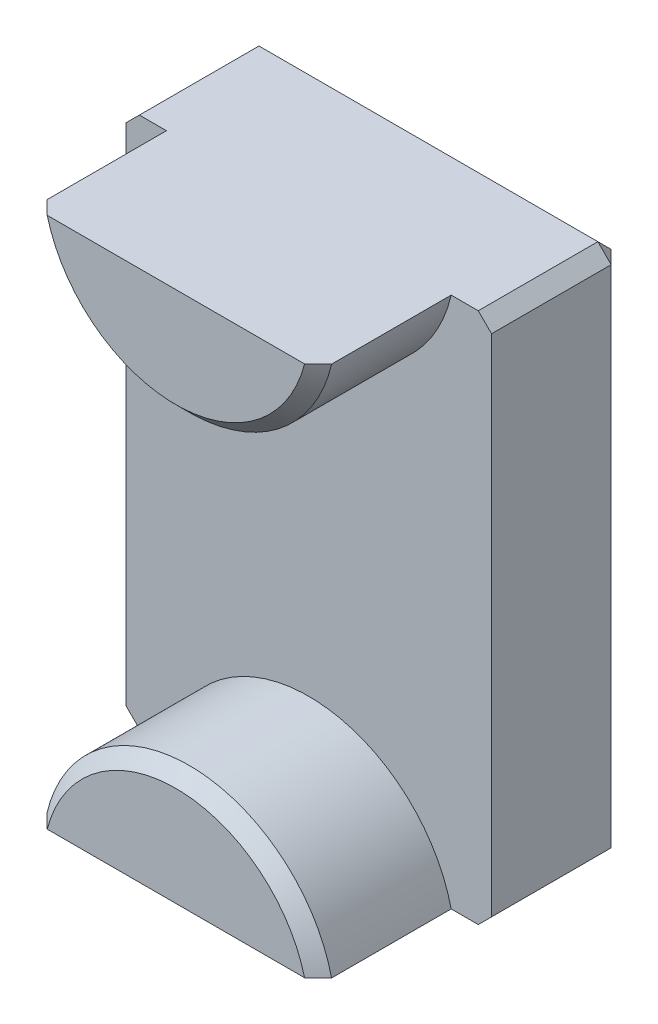
ISO-10303-21;
HEADER;
FILE_DESCRIPTION(('STEP AP214'),'2;1');
FILE_NAME('part.step','',(''),(''),'','','');
FILE_SCHEMA(('AUTOMOTIVE_DESIGN { 1 0 10303 214 1 1 1 1 }'));
ENDSEC;
DATA;
#1=APPLICATION_CONTEXT('core data for automotive mechanical design processes');
#2=APPLICATION_PROTOCOL_DEFINITION('international standard','automotive_design',2000,#1);
#3=PRODUCT_CONTEXT('',#1,'mechanical');
#4=PRODUCT('Part','Part','',(#3));
#5=PRODUCT_RELATED_PRODUCT_CATEGORY('part','',(#4));
#6=PRODUCT_DEFINITION_FORMATION('','',#4);
#7=PRODUCT_DEFINITION_CONTEXT('part definition',#1,'design');
#8=PRODUCT_DEFINITION('design','',#6,#7);
#9=PRODUCT_DEFINITION_SHAPE('','',#8);
#10=(LENGTH_UNIT() NAMED_UNIT(*) SI_UNIT(.MILLI.,.METRE.));
#11=(NAMED_UNIT(*) PLANE_ANGLE_UNIT() SI_UNIT($,.RADIAN.));
#12=(NAMED_UNIT(*) SI_UNIT($,.STERADIAN.) SOLID_ANGLE_UNIT());
#13=UNCERTAINTY_MEASURE_WITH_UNIT(LENGTH_MEASURE(1.E-05),#10,'distance_accuracy_value','');
#14=(GEOMETRIC_REPRESENTATION_CONTEXT(3) GLOBAL_UNCERTAINTY_ASSIGNED_CONTEXT((#13)) GLOBAL_UNIT_ASSIGNED_CONTEXT((#10,
#11,#12)) REPRESENTATION_CONTEXT('',''));
#15=CARTESIAN_POINT('',(0.,0.,0.));
#16=DIRECTION('',(0.,0.,1.));
#17=DIRECTION('',(1.,0.,0.));
#18=AXIS2_PLACEMENT_3D('',#15,#16,#17);
#19=CARTESIAN_POINT('',(2.75,4.,-2.));
#20=DIRECTION('',(1.,0.,0.));
#21=DIRECTION('',(0.,0.,-1.));
#22=AXIS2_PLACEMENT_3D('',#19,#20,#21);
#23=PLANE('',#22);
#24=DIRECTION('',(0.,1.,0.));
#25=VECTOR('',#24,1.);
#26=CARTESIAN_POINT('',(2.75,4.,0.));
#27=LINE('',#26,#25);
#28=CARTESIAN_POINT('',(2.75,-3.8,0.));
#29=VERTEX_POINT('',#28);
#30=CARTESIAN_POINT('',(2.75,3.8,0.));
#31=VERTEX_POINT('',#30);
#32=EDGE_CURVE('E200',#29,#31,#27,.T.);
#33=ORIENTED_EDGE('',*,*,#32,.F.);
#34=DIRECTION('',(0.,0.,-1.));
#35=VECTOR('',#34,1.);
#36=CARTESIAN_POINT('',(2.75,-3.8,-2.));
#37=LINE('',#36,#35);
#38=CARTESIAN_POINT('',(2.75,-3.8,-1.8));
#39=VERTEX_POINT('',#38);
#40=EDGE_CURVE('E11',#29,#39,#37,.T.);
#41=ORIENTED_EDGE('',*,*,#40,.T.);
#42=DIRECTION('',(0.,1.,0.));
#43=VECTOR('',#42,1.);
#44=CARTESIAN_POINT('',(2.75,4.,-1.8));
#45=LINE('',#44,#43);
#46=CARTESIAN_POINT('',(2.75,3.8,-1.8));
#47=VERTEX_POINT('',#46);
#48=EDGE_CURVE('E51',#39,#47,#45,.T.);
#49=ORIENTED_EDGE('',*,*,#48,.T.);
#50=DIRECTION('',(0.,0.,1.));
#51=VECTOR('',#50,1.);
#52=CARTESIAN_POINT('',(2.75,3.8,-2.));
#53=LINE('',#52,#51);
#54=EDGE_CURVE('E288',#47,#31,#53,.T.);
#55=ORIENTED_EDGE('',*,*,#54,.T.);
#56=EDGE_LOOP('',(#33,#41,#49,#55));
#57=FACE_BOUND('',#56,.T.);
#58=ADVANCED_FACE('F41',(#57),#23,.T.);
#59=CARTESIAN_POINT('',(-2.75,-4.,-2.));
#60=DIRECTION('',(0.,-1.,0.));
#61=DIRECTION('',(0.,0.,-1.));
#62=AXIS2_PLACEMENT_3D('',#59,#60,#61);
#63=PLANE('',#62);
#64=DIRECTION('',(0.,0.,-1.));
#65=VECTOR('',#64,1.);
#66=CARTESIAN_POINT('',(2.14242852856286,-4.,2.));
#67=LINE('',#66,#65);
#68=CARTESIAN_POINT('',(2.14242852856286,-4.,1.8));
#69=VERTEX_POINT('',#68);
#70=CARTESIAN_POINT('',(2.14242852856286,-4.,0.));
#71=VERTEX_POINT('',#70);
#72=EDGE_CURVE('E180',#69,#71,#67,.T.);
#73=ORIENTED_EDGE('',*,*,#72,.F.);
#74=CARTESIAN_POINT('',(2.14242852856286,-4.,1.8));
#75=CARTESIAN_POINT('',(2.10815351698605,-4.,1.83338254815782));
#76=CARTESIAN_POINT('',(2.07385460699673,-4.,1.86674048849602));
#77=CARTESIAN_POINT('',(2.00520898851269,-4.,1.93340715516509));
#78=CARTESIAN_POINT('',(1.97086228001563,-4.,1.96671588149356));
#79=CARTESIAN_POINT('',(1.93649167310371,-4.,2.));
#80=B_SPLINE_CURVE_WITH_KNOTS('',3,(#74,#75,#76,#77,#78,#79),.UNSPECIFIED.,.F.,.F.,(4,2,4),(0.,
0.143535733148788,0.287071473324752),.UNSPECIFIED.);
#81=CARTESIAN_POINT('',(1.93649167310371,-4.,2.));
#82=VERTEX_POINT('',#81);
#83=EDGE_CURVE('E223',#69,#82,#80,.T.);
#84=ORIENTED_EDGE('',*,*,#83,.T.);
#85=DIRECTION('',(-1.,0.,0.));
#86=VECTOR('',#85,1.);
#87=CARTESIAN_POINT('',(0.,-4.,2.));
#88=LINE('',#87,#86);
#89=CARTESIAN_POINT('',(-1.93649167310371,-4.,2.));
#90=VERTEX_POINT('',#89);
#91=EDGE_CURVE('E181',#82,#90,#88,.T.);
#92=ORIENTED_EDGE('',*,*,#91,.T.);
#93=CARTESIAN_POINT('',(-1.93649167310371,-4.,2.));
#94=CARTESIAN_POINT('',(-1.97086228001563,-4.,1.96671588149356));
#95=CARTESIAN_POINT('',(-2.00520898851269,-4.,1.93340715516509));
#96=CARTESIAN_POINT('',(-2.07385460699673,-4.,1.86674048849602));
#97=CARTESIAN_POINT('',(-2.10815351698605,-4.,1.83338254815782));
#98=CARTESIAN_POINT('',(-2.14242852856286,-4.,1.8));
#99=B_SPLINE_CURVE_WITH_KNOTS('',3,(#93,#94,#95,#96,#97,#98),.UNSPECIFIED.,.F.,.F.,(4,2,4),(0.,
0.143535740175964,0.287071473324752),.UNSPECIFIED.);
#100=CARTESIAN_POINT('',(-2.14242852856286,-4.,1.8));
#101=VERTEX_POINT('',#100);
#102=EDGE_CURVE('E176',#90,#101,#99,.T.);
#103=ORIENTED_EDGE('',*,*,#102,.T.);
#104=DIRECTION('',(0.,0.,-1.));
#105=VECTOR('',#104,1.);
#106=CARTESIAN_POINT('',(-2.14242852856286,-4.,2.));
#107=LINE('',#106,#105);
#108=CARTESIAN_POINT('',(-2.14242852856286,-4.,0.));
#109=VERTEX_POINT('',#108);
#110=EDGE_CURVE('E171',#101,#109,#107,.T.);
#111=ORIENTED_EDGE('',*,*,#110,.T.);
#112=DIRECTION('',(1.,0.,0.));
#113=VECTOR('',#112,1.);
#114=CARTESIAN_POINT('',(-2.75,-4.,0.));
#115=LINE('',#114,#113);
#116=CARTESIAN_POINT('',(-2.55,-4.,0.));
#117=VERTEX_POINT('',#116);
#118=EDGE_CURVE('E154',#117,#109,#115,.T.);
#119=ORIENTED_EDGE('',*,*,#118,.F.);
#120=DIRECTION('',(0.,0.,-1.));
#121=VECTOR('',#120,1.);
#122=CARTESIAN_POINT('',(-2.55,-4.,-2.));
#123=LINE('',#122,#121);
#124=CARTESIAN_POINT('',(-2.55,-4.,-1.8));
#125=VERTEX_POINT('',#124);
#126=EDGE_CURVE('E214',#117,#125,#123,.T.);
#127=ORIENTED_EDGE('',*,*,#126,.T.);
#128=DIRECTION('',(1.,0.,0.));
#129=VECTOR('',#128,1.);
#130=CARTESIAN_POINT('',(2.75,-4.,-1.8));
#131=LINE('',#130,#129);
#132=CARTESIAN_POINT('',(2.55,-4.,-1.8));
#133=VERTEX_POINT('',#132);
#134=EDGE_CURVE('E212',#125,#133,#131,.T.);
#135=ORIENTED_EDGE('',*,*,#134,.T.);
#136=DIRECTION('',(0.,0.,1.));
#137=VECTOR('',#136,1.);
#138=CARTESIAN_POINT('',(2.55,-4.,-2.));
#139=LINE('',#138,#137);
#140=CARTESIAN_POINT('',(2.55,-4.,0.));
#141=VERTEX_POINT('',#140);
#142=EDGE_CURVE('E210',#133,#141,#139,.T.);
#143=ORIENTED_EDGE('',*,*,#142,.T.);
#144=EDGE_CURVE('E168',#71,#141,#115,.T.);
#145=ORIENTED_EDGE('',*,*,#144,.F.);
#146=EDGE_LOOP('',(#73,#84,#92,#103,#111,#119,#127,#135,#143,#145));
#147=FACE_BOUND('',#146,.T.);
#148=ADVANCED_FACE('F173',(#147),#63,.T.);
#149=CARTESIAN_POINT('',(-2.75,4.,-2.));
#150=DIRECTION('',(-1.,0.,0.));
#151=DIRECTION('',(0.,0.,1.));
#152=AXIS2_PLACEMENT_3D('',#149,#150,#151);
#153=PLANE('',#152);
#154=DIRECTION('',(0.,-1.,0.));
#155=VECTOR('',#154,1.);
#156=CARTESIAN_POINT('',(-2.75,4.,0.));
#157=LINE('',#156,#155);
#158=CARTESIAN_POINT('',(-2.75,3.8,0.));
#159=VERTEX_POINT('',#158);
#160=CARTESIAN_POINT('',(-2.75,-3.8,0.));
#161=VERTEX_POINT('',#160);
#162=EDGE_CURVE('E207',#159,#161,#157,.T.);
#163=ORIENTED_EDGE('',*,*,#162,.F.);
#164=DIRECTION('',(0.,0.,-1.));
#165=VECTOR('',#164,1.);
#166=CARTESIAN_POINT('',(-2.75,3.8,-2.));
#167=LINE('',#166,#165);
#168=CARTESIAN_POINT('',(-2.75,3.8,-1.8));
#169=VERTEX_POINT('',#168);
#170=EDGE_CURVE('E313',#159,#169,#167,.T.);
#171=ORIENTED_EDGE('',*,*,#170,.T.);
#172=DIRECTION('',(0.,-1.,0.));
#173=VECTOR('',#172,1.);
#174=CARTESIAN_POINT('',(-2.75,-4.,-1.8));
#175=LINE('',#174,#173);
#176=CARTESIAN_POINT('',(-2.75,-3.8,-1.8));
#177=VERTEX_POINT('',#176);
#178=EDGE_CURVE('E347',#169,#177,#175,.T.);
#179=ORIENTED_EDGE('',*,*,#178,.T.);
#180=DIRECTION('',(0.,0.,1.));
#181=VECTOR('',#180,1.);
#182=CARTESIAN_POINT('',(-2.75,-3.8,-2.));
#183=LINE('',#182,#181);
#184=EDGE_CURVE('E366',#177,#161,#183,.T.);
#185=ORIENTED_EDGE('',*,*,#184,.T.);
#186=EDGE_LOOP('',(#163,#171,#179,#185));
#187=FACE_BOUND('',#186,.T.);
#188=ADVANCED_FACE('F276',(#187),#153,.T.);
#189=CARTESIAN_POINT('',(-2.75,4.,-2.));
#190=DIRECTION('',(0.,1.,0.));
#191=DIRECTION('',(0.,0.,1.));
#192=AXIS2_PLACEMENT_3D('',#189,#190,#191);
#193=PLANE('',#192);
#194=DIRECTION('',(-1.,0.,0.));
#195=VECTOR('',#194,1.);
#196=CARTESIAN_POINT('',(0.,4.,2.));
#197=LINE('',#196,#195);
#198=CARTESIAN_POINT('',(1.93649167310371,4.,2.));
#199=VERTEX_POINT('',#198);
#200=CARTESIAN_POINT('',(-1.93649167310371,4.,2.));
#201=VERTEX_POINT('',#200);
#202=EDGE_CURVE('E191',#199,#201,#197,.T.);
#203=ORIENTED_EDGE('',*,*,#202,.F.);
#204=CARTESIAN_POINT('',(1.93649167310371,4.,2.));
#205=CARTESIAN_POINT('',(1.97086228001563,4.,1.96671588149356));
#206=CARTESIAN_POINT('',(2.00520898851269,4.,1.93340715516509));
#207=CARTESIAN_POINT('',(2.07385460699673,4.,1.86674048849602));
#208=CARTESIAN_POINT('',(2.10815351698605,4.,1.83338254815782));
#209=CARTESIAN_POINT('',(2.14242852856286,4.,1.8));
#210=B_SPLINE_CURVE_WITH_KNOTS('',3,(#204,#205,#206,#207,#208,#209),.UNSPECIFIED.,.F.,.F.,(4,2,
4),(0.,0.143535740175966,0.287071473324756),.UNSPECIFIED.);
#211=CARTESIAN_POINT('',(2.14242852856286,4.,1.8));
#212=VERTEX_POINT('',#211);
#213=EDGE_CURVE('E264',#199,#212,#210,.T.);
#214=ORIENTED_EDGE('',*,*,#213,.T.);
#215=DIRECTION('',(0.,0.,-1.));
#216=VECTOR('',#215,1.);
#217=CARTESIAN_POINT('',(2.14242852856286,4.,2.));
#218=LINE('',#217,#216);
#219=CARTESIAN_POINT('',(2.14242852856286,4.,0.));
#220=VERTEX_POINT('',#219);
#221=EDGE_CURVE('E194',#212,#220,#218,.T.);
#222=ORIENTED_EDGE('',*,*,#221,.T.);
#223=DIRECTION('',(-1.,0.,0.));
#224=VECTOR('',#223,1.);
#225=CARTESIAN_POINT('',(-2.75,4.,0.));
#226=LINE('',#225,#224);
#227=CARTESIAN_POINT('',(2.55,4.,0.));
#228=VERTEX_POINT('',#227);
#229=EDGE_CURVE('E204',#228,#220,#226,.T.);
#230=ORIENTED_EDGE('',*,*,#229,.F.);
#231=DIRECTION('',(0.,0.,-1.));
#232=VECTOR('',#231,1.);
#233=CARTESIAN_POINT('',(2.55,4.,-2.));
#234=LINE('',#233,#232);
#235=CARTESIAN_POINT('',(2.55,4.,-1.8));
#236=VERTEX_POINT('',#235);
#237=EDGE_CURVE('E392',#228,#236,#234,.T.);
#238=ORIENTED_EDGE('',*,*,#237,.T.);
#239=DIRECTION('',(-1.,0.,0.));
#240=VECTOR('',#239,1.);
#241=CARTESIAN_POINT('',(-2.75,4.,-1.8));
#242=LINE('',#241,#240);
#243=CARTESIAN_POINT('',(-2.55,4.,-1.8));
#244=VERTEX_POINT('',#243);
#245=EDGE_CURVE('E380',#236,#244,#242,.T.);
#246=ORIENTED_EDGE('',*,*,#245,.T.);
#247=DIRECTION('',(0.,0.,1.));
#248=VECTOR('',#247,1.);
#249=CARTESIAN_POINT('',(-2.55,4.,-2.));
#250=LINE('',#249,#248);
#251=CARTESIAN_POINT('',(-2.55,4.,0.));
#252=VERTEX_POINT('',#251);
#253=EDGE_CURVE('E373',#244,#252,#250,.T.);
#254=ORIENTED_EDGE('',*,*,#253,.T.);
#255=CARTESIAN_POINT('',(-2.14242852856286,4.,0.));
#256=VERTEX_POINT('',#255);
#257=EDGE_CURVE('E203',#256,#252,#226,.T.);
#258=ORIENTED_EDGE('',*,*,#257,.F.);
#259=DIRECTION('',(0.,0.,-1.));
#260=VECTOR('',#259,1.);
#261=CARTESIAN_POINT('',(-2.14242852856286,4.,2.));
#262=LINE('',#261,#260);
#263=CARTESIAN_POINT('',(-2.14242852856286,4.,1.8));
#264=VERTEX_POINT('',#263);
#265=EDGE_CURVE('E198',#264,#256,#262,.T.);
#266=ORIENTED_EDGE('',*,*,#265,.F.);
#267=CARTESIAN_POINT('',(-2.14242852856286,4.,1.8));
#268=CARTESIAN_POINT('',(-2.10815351698605,4.,1.83338254815782));
#269=CARTESIAN_POINT('',(-2.07385460699673,4.,1.86674048849602));
#270=CARTESIAN_POINT('',(-2.00520898851269,4.,1.93340715516509));
#271=CARTESIAN_POINT('',(-1.97086228001563,4.,1.96671588149356));
#272=CARTESIAN_POINT('',(-1.93649167310371,4.,2.));
#273=B_SPLINE_CURVE_WITH_KNOTS('',3,(#267,#268,#269,#270,#271,#272),.UNSPECIFIED.,.F.,.F.,(4,2,
4),(0.,0.14353573314879,0.287071473324756),.UNSPECIFIED.);
#274=EDGE_CURVE('E257',#264,#201,#273,.T.);
#275=ORIENTED_EDGE('',*,*,#274,.T.);
#276=EDGE_LOOP('',(#203,#214,#222,#230,#238,#246,#254,#258,#266,#275));
#277=FACE_BOUND('',#276,.T.);
#278=ADVANCED_FACE('F272',(#277),#193,.T.);
#279=CARTESIAN_POINT('',(0.,0.,-2.));
#280=DIRECTION('',(0.,0.,1.));
#281=DIRECTION('',(1.,0.,0.));
#282=AXIS2_PLACEMENT_3D('',#279,#280,#281);
#283=PLANE('',#282);
#284=DIRECTION('',(0.,1.,0.));
#285=VECTOR('',#284,1.);
#286=CARTESIAN_POINT('',(-2.55,4.,-2.));
#287=LINE('',#286,#285);
#288=CARTESIAN_POINT('',(-2.55,-3.8,-2.));
#289=VERTEX_POINT('',#288);
#290=CARTESIAN_POINT('',(-2.55,3.8,-2.));
#291=VERTEX_POINT('',#290);
#292=EDGE_CURVE('E349',#289,#291,#287,.T.);
#293=ORIENTED_EDGE('',*,*,#292,.T.);
#294=DIRECTION('',(1.,0.,0.));
#295=VECTOR('',#294,1.);
#296=CARTESIAN_POINT('',(2.75,3.8,-2.));
#297=LINE('',#296,#295);
#298=CARTESIAN_POINT('',(2.55,3.8,-2.));
#299=VERTEX_POINT('',#298);
#300=EDGE_CURVE('E353',#291,#299,#297,.T.);
#301=ORIENTED_EDGE('',*,*,#300,.T.);
#302=DIRECTION('',(0.,-1.,0.));
#303=VECTOR('',#302,1.);
#304=CARTESIAN_POINT('',(2.55,-4.,-2.));
#305=LINE('',#304,#303);
#306=CARTESIAN_POINT('',(2.55,-3.8,-2.));
#307=VERTEX_POINT('',#306);
#308=EDGE_CURVE('E358',#299,#307,#305,.T.);
#309=ORIENTED_EDGE('',*,*,#308,.T.);
#310=DIRECTION('',(-1.,0.,0.));
#311=VECTOR('',#310,1.);
#312=CARTESIAN_POINT('',(-2.75,-3.8,-2.));
#313=LINE('',#312,#311);
#314=EDGE_CURVE('E354',#307,#289,#313,.T.);
#315=ORIENTED_EDGE('',*,*,#314,.T.);
#316=EDGE_LOOP('',(#293,#301,#309,#315));
#317=FACE_BOUND('',#316,.T.);
#318=ADVANCED_FACE('F275',(#317),#283,.F.);
#319=CARTESIAN_POINT('',(0.,0.,0.));
#320=DIRECTION('',(0.,0.,1.));
#321=DIRECTION('',(1.,0.,0.));
#322=AXIS2_PLACEMENT_3D('',#319,#320,#321);
#323=PLANE('',#322);
#324=ORIENTED_EDGE('',*,*,#257,.T.);
#325=DIRECTION('',(0.707106781186549,0.707106781186546,0.));
#326=VECTOR('',#325,1.);
#327=CARTESIAN_POINT('',(-3.27499999999999,3.27500000000001,0.));
#328=LINE('',#327,#326);
#329=EDGE_CURVE('E364',#252,#159,#328,.F.);
#330=ORIENTED_EDGE('',*,*,#329,.T.);
#331=ORIENTED_EDGE('',*,*,#162,.T.);
#332=DIRECTION('',(-0.707106781186549,0.707106781186546,0.));
#333=VECTOR('',#332,1.);
#334=CARTESIAN_POINT('',(-3.27499999999999,-3.27500000000001,0.));
#335=LINE('',#334,#333);
#336=EDGE_CURVE('E164',#161,#117,#335,.F.);
#337=ORIENTED_EDGE('',*,*,#336,.T.);
#338=ORIENTED_EDGE('',*,*,#118,.T.);
#339=CARTESIAN_POINT('',(0.,-4.5,0.));
#340=DIRECTION('',(0.,0.,-1.));
#341=DIRECTION('',(1.,0.,0.));
#342=AXIS2_PLACEMENT_3D('',#339,#340,#341);
#343=CIRCLE('',#342,2.2);
#344=EDGE_CURVE('E160',#109,#71,#343,.T.);
#345=ORIENTED_EDGE('',*,*,#344,.T.);
#346=ORIENTED_EDGE('',*,*,#144,.T.);
#347=DIRECTION('',(-0.707106781186549,-0.707106781186546,0.));
#348=VECTOR('',#347,1.);
#349=CARTESIAN_POINT('',(3.27499999999999,-3.27500000000001,0.));
#350=LINE('',#349,#348);
#351=EDGE_CURVE('E293',#141,#29,#350,.F.);
#352=ORIENTED_EDGE('',*,*,#351,.T.);
#353=ORIENTED_EDGE('',*,*,#32,.T.);
#354=DIRECTION('',(0.707106781186549,-0.707106781186546,0.));
#355=VECTOR('',#354,1.);
#356=CARTESIAN_POINT('',(3.27499999999999,3.27500000000001,0.));
#357=LINE('',#356,#355);
#358=EDGE_CURVE('E356',#31,#228,#357,.F.);
#359=ORIENTED_EDGE('',*,*,#358,.T.);
#360=ORIENTED_EDGE('',*,*,#229,.T.);
#361=CARTESIAN_POINT('',(0.,4.5,0.));
#362=DIRECTION('',(0.,0.,1.));
#363=DIRECTION('',(1.,0.,0.));
#364=AXIS2_PLACEMENT_3D('',#361,#362,#363);
#365=CIRCLE('',#364,2.2);
#366=EDGE_CURVE('E190',#256,#220,#365,.T.);
#367=ORIENTED_EDGE('',*,*,#366,.F.);
#368=EDGE_LOOP('',(#324,#330,#331,#337,#338,#345,#346,#352,#353,#359,#360,#367));
#369=FACE_BOUND('',#368,.T.);
#370=ADVANCED_FACE('F157',(#369),#323,.T.);
#371=CARTESIAN_POINT('',(0.,4.5,2.));
#372=DIRECTION('',(0.,0.,-1.));
#373=DIRECTION('',(-1.,0.,0.));
#374=AXIS2_PLACEMENT_3D('',#371,#372,#373);
#375=CYLINDRICAL_SURFACE('',#374,2.2);
#376=ORIENTED_EDGE('',*,*,#221,.F.);
#377=CARTESIAN_POINT('',(0.,4.5,1.8));
#378=DIRECTION('',(0.,0.,1.));
#379=DIRECTION('',(1.,0.,0.));
#380=AXIS2_PLACEMENT_3D('',#377,#378,#379);
#381=CIRCLE('',#380,2.2);
#382=EDGE_CURVE('E270',#212,#264,#381,.F.);
#383=ORIENTED_EDGE('',*,*,#382,.T.);
#384=ORIENTED_EDGE('',*,*,#265,.T.);
#385=ORIENTED_EDGE('',*,*,#366,.T.);
#386=EDGE_LOOP('',(#376,#383,#384,#385));
#387=FACE_BOUND('',#386,.T.);
#388=ADVANCED_FACE('F412',(#387),#375,.T.);
#389=CARTESIAN_POINT('',(0.,0.,2.));
#390=DIRECTION('',(0.,0.,1.));
#391=DIRECTION('',(1.,0.,0.));
#392=AXIS2_PLACEMENT_3D('',#389,#390,#391);
#393=PLANE('',#392);
#394=ORIENTED_EDGE('',*,*,#202,.T.);
#395=CARTESIAN_POINT('',(0.,4.5,2.));
#396=DIRECTION('',(0.,0.,1.));
#397=DIRECTION('',(1.,0.,0.));
#398=AXIS2_PLACEMENT_3D('',#395,#396,#397);
#399=CIRCLE('',#398,2.);
#400=EDGE_CURVE('E396',#201,#199,#399,.T.);
#401=ORIENTED_EDGE('',*,*,#400,.T.);
#402=EDGE_LOOP('',(#394,#401));
#403=FACE_BOUND('',#402,.T.);
#404=ADVANCED_FACE('F407',(#403),#393,.T.);
#405=CARTESIAN_POINT('',(0.,-4.5,2.));
#406=DIRECTION('',(0.,0.,-1.));
#407=DIRECTION('',(-1.,0.,0.));
#408=AXIS2_PLACEMENT_3D('',#405,#406,#407);
#409=CYLINDRICAL_SURFACE('',#408,2.2);
#410=ORIENTED_EDGE('',*,*,#110,.F.);
#411=CARTESIAN_POINT('',(0.,-4.5,1.8));
#412=DIRECTION('',(0.,0.,1.));
#413=DIRECTION('',(1.,0.,0.));
#414=AXIS2_PLACEMENT_3D('',#411,#412,#413);
#415=CIRCLE('',#414,2.2);
#416=EDGE_CURVE('E167',#101,#69,#415,.F.);
#417=ORIENTED_EDGE('',*,*,#416,.T.);
#418=ORIENTED_EDGE('',*,*,#72,.T.);
#419=ORIENTED_EDGE('',*,*,#344,.F.);
#420=EDGE_LOOP('',(#410,#417,#418,#419));
#421=FACE_BOUND('',#420,.T.);
#422=ADVANCED_FACE('F183',(#421),#409,.T.);
#423=CARTESIAN_POINT('',(0.,0.,2.));
#424=DIRECTION('',(0.,0.,1.));
#425=DIRECTION('',(1.,0.,0.));
#426=AXIS2_PLACEMENT_3D('',#423,#424,#425);
#427=PLANE('',#426);
#428=ORIENTED_EDGE('',*,*,#91,.F.);
#429=CARTESIAN_POINT('',(0.,-4.5,2.));
#430=DIRECTION('',(0.,0.,1.));
#431=DIRECTION('',(1.,0.,0.));
#432=AXIS2_PLACEMENT_3D('',#429,#430,#431);
#433=CIRCLE('',#432,2.);
#434=EDGE_CURVE('E398',#82,#90,#433,.T.);
#435=ORIENTED_EDGE('',*,*,#434,.T.);
#436=EDGE_LOOP('',(#428,#435));
#437=FACE_BOUND('',#436,.T.);
#438=ADVANCED_FACE('F242',(#437),#427,.T.);
#439=CARTESIAN_POINT('',(0.,-4.5,1.8));
#440=DIRECTION('',(0.,0.,-1.));
#441=DIRECTION('',(-1.,0.,0.));
#442=AXIS2_PLACEMENT_3D('',#439,#440,#441);
#443=CONICAL_SURFACE('',#442,2.2,0.785398163397452);
#444=ORIENTED_EDGE('',*,*,#102,.F.);
#445=ORIENTED_EDGE('',*,*,#434,.F.);
#446=ORIENTED_EDGE('',*,*,#83,.F.);
#447=ORIENTED_EDGE('',*,*,#416,.F.);
#448=EDGE_LOOP('',(#444,#445,#446,#447));
#449=FACE_BOUND('',#448,.T.);
#450=ADVANCED_FACE('F233',(#449),#443,.T.);
#451=CARTESIAN_POINT('',(0.,4.5,2.));
#452=DIRECTION('',(0.,0.,-1.));
#453=DIRECTION('',(-1.,0.,0.));
#454=AXIS2_PLACEMENT_3D('',#451,#452,#453);
#455=CONICAL_SURFACE('',#454,2.,0.785398163397447);
#456=ORIENTED_EDGE('',*,*,#274,.F.);
#457=ORIENTED_EDGE('',*,*,#382,.F.);
#458=ORIENTED_EDGE('',*,*,#213,.F.);
#459=ORIENTED_EDGE('',*,*,#400,.F.);
#460=EDGE_LOOP('',(#456,#457,#458,#459));
#461=FACE_BOUND('',#460,.T.);
#462=ADVANCED_FACE('F241',(#461),#455,.T.);
#463=CARTESIAN_POINT('',(2.55,-4.,-2.));
#464=DIRECTION('',(-0.707106781186546,0.707106781186549,0.));
#465=DIRECTION('',(0.,0.,1.));
#466=AXIS2_PLACEMENT_3D('',#463,#464,#465);
#467=PLANE('',#466);
#468=ORIENTED_EDGE('',*,*,#351,.F.);
#469=ORIENTED_EDGE('',*,*,#142,.F.);
#470=DIRECTION('',(0.707106781186549,0.707106781186546,0.));
#471=VECTOR('',#470,1.);
#472=CARTESIAN_POINT('',(2.55,-4.,-1.8));
#473=LINE('',#472,#471);
#474=EDGE_CURVE('E187',#39,#133,#473,.F.);
#475=ORIENTED_EDGE('',*,*,#474,.F.);
#476=ORIENTED_EDGE('',*,*,#40,.F.);
#477=EDGE_LOOP('',(#468,#469,#475,#476));
#478=FACE_BOUND('',#477,.T.);
#479=ADVANCED_FACE('F44',(#478),#467,.F.);
#480=CARTESIAN_POINT('',(-2.75,-3.8,-2.));
#481=DIRECTION('',(0.707106781186546,0.707106781186549,0.));
#482=DIRECTION('',(0.,0.,1.));
#483=AXIS2_PLACEMENT_3D('',#480,#481,#482);
#484=PLANE('',#483);
#485=ORIENTED_EDGE('',*,*,#336,.F.);
#486=ORIENTED_EDGE('',*,*,#184,.F.);
#487=DIRECTION('',(0.707106781186549,-0.707106781186546,0.));
#488=VECTOR('',#487,1.);
#489=CARTESIAN_POINT('',(-2.75,-3.8,-1.8));
#490=LINE('',#489,#488);
#491=EDGE_CURVE('E298',#125,#177,#490,.F.);
#492=ORIENTED_EDGE('',*,*,#491,.F.);
#493=ORIENTED_EDGE('',*,*,#126,.F.);
#494=EDGE_LOOP('',(#485,#486,#492,#493));
#495=FACE_BOUND('',#494,.T.);
#496=ADVANCED_FACE('F386',(#495),#484,.F.);
#497=CARTESIAN_POINT('',(-2.75,-4.,-1.8));
#498=DIRECTION('',(0.,-0.707106781186546,-0.707106781186549));
#499=DIRECTION('',(-1.,0.,0.));
#500=AXIS2_PLACEMENT_3D('',#497,#498,#499);
#501=PLANE('',#500);
#502=DIRECTION('',(0.,0.707106781186549,-0.707106781186546));
#503=VECTOR('',#502,1.);
#504=CARTESIAN_POINT('',(2.55,-4.,-1.8));
#505=LINE('',#504,#503);
#506=EDGE_CURVE('E46',#133,#307,#505,.T.);
#507=ORIENTED_EDGE('',*,*,#506,.F.);
#508=ORIENTED_EDGE('',*,*,#134,.F.);
#509=DIRECTION('',(0.,-0.707106781186549,0.707106781186546));
#510=VECTOR('',#509,1.);
#511=CARTESIAN_POINT('',(-2.55,-3.9,-1.9));
#512=LINE('',#511,#510);
#513=EDGE_CURVE('E304',#289,#125,#512,.T.);
#514=ORIENTED_EDGE('',*,*,#513,.F.);
#515=ORIENTED_EDGE('',*,*,#314,.F.);
#516=EDGE_LOOP('',(#507,#508,#514,#515));
#517=FACE_BOUND('',#516,.T.);
#518=ADVANCED_FACE('F384',(#517),#501,.T.);
#519=CARTESIAN_POINT('',(2.55,-4.,-1.8));
#520=DIRECTION('',(0.577350269189623,-0.577350269189626,-0.577350269189628));
#521=DIRECTION('',(0.,0.707106781186549,-0.707106781186546));
#522=AXIS2_PLACEMENT_3D('',#519,#520,#521);
#523=PLANE('',#522);
#524=ORIENTED_EDGE('',*,*,#474,.T.);
#525=ORIENTED_EDGE('',*,*,#506,.T.);
#526=DIRECTION('',(0.707106781186549,0.,0.707106781186546));
#527=VECTOR('',#526,1.);
#528=CARTESIAN_POINT('',(2.65,-3.8,-1.9));
#529=LINE('',#528,#527);
#530=EDGE_CURVE('E300',#39,#307,#529,.F.);
#531=ORIENTED_EDGE('',*,*,#530,.F.);
#532=EDGE_LOOP('',(#524,#525,#531));
#533=FACE_BOUND('',#532,.T.);
#534=ADVANCED_FACE('F301',(#533),#523,.T.);
#535=CARTESIAN_POINT('',(-2.75,-3.8,-1.8));
#536=DIRECTION('',(-0.577350269189623,-0.577350269189626,-0.577350269189628));
#537=DIRECTION('',(0.,0.707106781186549,-0.707106781186546));
#538=AXIS2_PLACEMENT_3D('',#535,#536,#537);
#539=PLANE('',#538);
#540=ORIENTED_EDGE('',*,*,#513,.T.);
#541=ORIENTED_EDGE('',*,*,#491,.T.);
#542=DIRECTION('',(0.707106781186549,0.,-0.707106781186546));
#543=VECTOR('',#542,1.);
#544=CARTESIAN_POINT('',(-2.75,-3.8,-1.8));
#545=LINE('',#544,#543);
#546=EDGE_CURVE('E305',#289,#177,#545,.F.);
#547=ORIENTED_EDGE('',*,*,#546,.F.);
#548=EDGE_LOOP('',(#540,#541,#547));
#549=FACE_BOUND('',#548,.T.);
#550=ADVANCED_FACE('F338',(#549),#539,.T.);
#551=CARTESIAN_POINT('',(2.75,4.,-1.8));
#552=DIRECTION('',(0.707106781186546,0.,-0.707106781186549));
#553=DIRECTION('',(0.,-1.,0.));
#554=AXIS2_PLACEMENT_3D('',#551,#552,#553);
#555=PLANE('',#554);
#556=ORIENTED_EDGE('',*,*,#530,.T.);
#557=ORIENTED_EDGE('',*,*,#308,.F.);
#558=DIRECTION('',(-0.707106781186549,0.,-0.707106781186546));
#559=VECTOR('',#558,1.);
#560=CARTESIAN_POINT('',(2.55,3.8,-2.));
#561=LINE('',#560,#559);
#562=EDGE_CURVE('E310',#47,#299,#561,.T.);
#563=ORIENTED_EDGE('',*,*,#562,.F.);
#564=ORIENTED_EDGE('',*,*,#48,.F.);
#565=EDGE_LOOP('',(#556,#557,#563,#564));
#566=FACE_BOUND('',#565,.T.);
#567=ADVANCED_FACE('F308',(#566),#555,.T.);
#568=CARTESIAN_POINT('',(2.75,3.8,-2.));
#569=DIRECTION('',(-0.707106781186546,-0.707106781186549,0.));
#570=DIRECTION('',(0.,0.,1.));
#571=AXIS2_PLACEMENT_3D('',#568,#569,#570);
#572=PLANE('',#571);
#573=ORIENTED_EDGE('',*,*,#358,.F.);
#574=ORIENTED_EDGE('',*,*,#54,.F.);
#575=DIRECTION('',(-0.707106781186549,0.707106781186546,0.));
#576=VECTOR('',#575,1.);
#577=CARTESIAN_POINT('',(2.65,3.9,-1.8));
#578=LINE('',#577,#576);
#579=EDGE_CURVE('E327',#236,#47,#578,.F.);
#580=ORIENTED_EDGE('',*,*,#579,.F.);
#581=ORIENTED_EDGE('',*,*,#237,.F.);
#582=EDGE_LOOP('',(#573,#574,#580,#581));
#583=FACE_BOUND('',#582,.T.);
#584=ADVANCED_FACE('F508',(#583),#572,.F.);
#585=CARTESIAN_POINT('',(-2.55,4.,-2.));
#586=DIRECTION('',(0.707106781186546,-0.707106781186549,0.));
#587=DIRECTION('',(0.,0.,1.));
#588=AXIS2_PLACEMENT_3D('',#585,#586,#587);
#589=PLANE('',#588);
#590=ORIENTED_EDGE('',*,*,#329,.F.);
#591=ORIENTED_EDGE('',*,*,#253,.F.);
#592=DIRECTION('',(-0.707106781186549,-0.707106781186546,0.));
#593=VECTOR('',#592,1.);
#594=CARTESIAN_POINT('',(-2.55,4.,-1.8));
#595=LINE('',#594,#593);
#596=EDGE_CURVE('E324',#169,#244,#595,.F.);
#597=ORIENTED_EDGE('',*,*,#596,.F.);
#598=ORIENTED_EDGE('',*,*,#170,.F.);
#599=EDGE_LOOP('',(#590,#591,#597,#598));
#600=FACE_BOUND('',#599,.T.);
#601=ADVANCED_FACE('F371',(#600),#589,.F.);
#602=CARTESIAN_POINT('',(-2.75,4.,-1.8));
#603=DIRECTION('',(-0.707106781186546,0.,-0.707106781186549));
#604=DIRECTION('',(0.,1.,0.));
#605=AXIS2_PLACEMENT_3D('',#602,#603,#604);
#606=PLANE('',#605);
#607=ORIENTED_EDGE('',*,*,#546,.T.);
#608=ORIENTED_EDGE('',*,*,#178,.F.);
#609=DIRECTION('',(-0.707106781186549,0.,0.707106781186546));
#610=VECTOR('',#609,1.);
#611=CARTESIAN_POINT('',(-2.65,3.8,-1.9));
#612=LINE('',#611,#610);
#613=EDGE_CURVE('E321',#291,#169,#612,.T.);
#614=ORIENTED_EDGE('',*,*,#613,.F.);
#615=ORIENTED_EDGE('',*,*,#292,.F.);
#616=EDGE_LOOP('',(#607,#608,#614,#615));
#617=FACE_BOUND('',#616,.T.);
#618=ADVANCED_FACE('F345',(#617),#606,.T.);
#619=CARTESIAN_POINT('',(2.55,3.8,-2.));
#620=DIRECTION('',(0.577350269189623,0.577350269189628,-0.577350269189626));
#621=DIRECTION('',(0.,0.707106781186546,0.707106781186549));
#622=AXIS2_PLACEMENT_3D('',#619,#620,#621);
#623=PLANE('',#622);
#624=ORIENTED_EDGE('',*,*,#579,.T.);
#625=ORIENTED_EDGE('',*,*,#562,.T.);
#626=DIRECTION('',(0.,0.707106781186546,0.707106781186549));
#627=VECTOR('',#626,1.);
#628=CARTESIAN_POINT('',(2.55,3.8,-2.));
#629=LINE('',#628,#627);
#630=EDGE_CURVE('E319',#236,#299,#629,.F.);
#631=ORIENTED_EDGE('',*,*,#630,.F.);
#632=EDGE_LOOP('',(#624,#625,#631));
#633=FACE_BOUND('',#632,.T.);
#634=ADVANCED_FACE('F537',(#633),#623,.T.);
#635=CARTESIAN_POINT('',(-2.55,4.,-1.8));
#636=DIRECTION('',(-0.577350269189623,0.577350269189628,-0.577350269189626));
#637=DIRECTION('',(0.,0.707106781186546,0.707106781186549));
#638=AXIS2_PLACEMENT_3D('',#635,#636,#637);
#639=PLANE('',#638);
#640=ORIENTED_EDGE('',*,*,#613,.T.);
#641=ORIENTED_EDGE('',*,*,#596,.T.);
#642=DIRECTION('',(0.,-0.707106781186546,-0.707106781186549));
#643=VECTOR('',#642,1.);
#644=CARTESIAN_POINT('',(-2.55,4.,-1.8));
#645=LINE('',#644,#643);
#646=EDGE_CURVE('E317',#291,#244,#645,.F.);
#647=ORIENTED_EDGE('',*,*,#646,.F.);
#648=EDGE_LOOP('',(#640,#641,#647));
#649=FACE_BOUND('',#648,.T.);
#650=ADVANCED_FACE('F377',(#649),#639,.T.);
#651=CARTESIAN_POINT('',(-2.75,4.,-1.8));
#652=DIRECTION('',(0.,0.707106781186549,-0.707106781186546));
#653=DIRECTION('',(1.,0.,0.));
#654=AXIS2_PLACEMENT_3D('',#651,#652,#653);
#655=PLANE('',#654);
#656=ORIENTED_EDGE('',*,*,#630,.T.);
#657=ORIENTED_EDGE('',*,*,#300,.F.);
#658=ORIENTED_EDGE('',*,*,#646,.T.);
#659=ORIENTED_EDGE('',*,*,#245,.F.);
#660=EDGE_LOOP('',(#656,#657,#658,#659));
#661=FACE_BOUND('',#660,.T.);
#662=ADVANCED_FACE('F253',(#661),#655,.T.);
#663=CLOSED_SHELL('',(#58,#148,#188,#278,#318,#370,#388,#404,#422,#438,#450,#462,#479,#496,#518,
#534,#550,#567,#584,#601,#618,#634,#650,#662));
#664=MANIFOLD_SOLID_BREP('B2',#663);
#665=ADVANCED_BREP_SHAPE_REPRESENTATION('',(#18,#664),#14);
#666=SHAPE_DEFINITION_REPRESENTATION(#9,#665);
ENDSEC;
END-ISO-10303-21;
